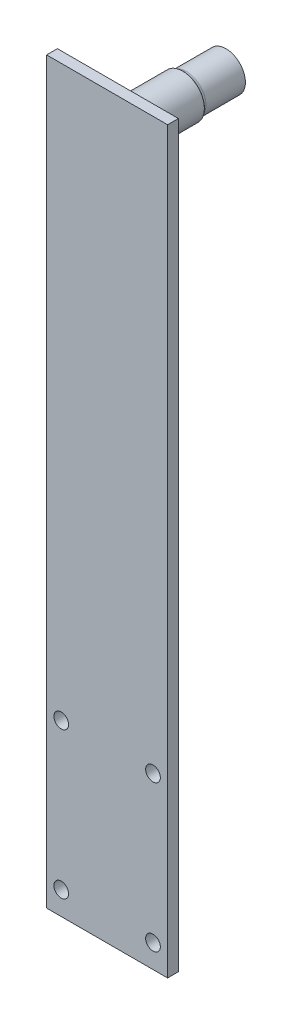
ISO-10303-21;
HEADER;
FILE_DESCRIPTION(('STEP AP214'),'2;1');
FILE_NAME('part.step','',(''),(''),'','','');
FILE_SCHEMA(('AUTOMOTIVE_DESIGN { 1 0 10303 214 1 1 1 1 }'));
ENDSEC;
DATA;
#1=APPLICATION_CONTEXT('core data for automotive mechanical design processes');
#2=APPLICATION_PROTOCOL_DEFINITION('international standard','automotive_design',2000,#1);
#3=PRODUCT_CONTEXT('',#1,'mechanical');
#4=PRODUCT('Part','Part','',(#3));
#5=PRODUCT_RELATED_PRODUCT_CATEGORY('part','',(#4));
#6=PRODUCT_DEFINITION_FORMATION('','',#4);
#7=PRODUCT_DEFINITION_CONTEXT('part definition',#1,'design');
#8=PRODUCT_DEFINITION('design','',#6,#7);
#9=PRODUCT_DEFINITION_SHAPE('','',#8);
#10=(LENGTH_UNIT() NAMED_UNIT(*) SI_UNIT(.MILLI.,.METRE.));
#11=(NAMED_UNIT(*) PLANE_ANGLE_UNIT() SI_UNIT($,.RADIAN.));
#12=(NAMED_UNIT(*) SI_UNIT($,.STERADIAN.) SOLID_ANGLE_UNIT());
#13=UNCERTAINTY_MEASURE_WITH_UNIT(LENGTH_MEASURE(1.E-05),#10,'distance_accuracy_value','');
#14=(GEOMETRIC_REPRESENTATION_CONTEXT(3) GLOBAL_UNCERTAINTY_ASSIGNED_CONTEXT((#13)) GLOBAL_UNIT_ASSIGNED_CONTEXT((#10,
#11,#12)) REPRESENTATION_CONTEXT('',''));
#15=CARTESIAN_POINT('',(0.,0.,0.));
#16=DIRECTION('',(0.,0.,1.));
#17=DIRECTION('',(1.,0.,0.));
#18=AXIS2_PLACEMENT_3D('',#15,#16,#17);
#19=CARTESIAN_POINT('',(28.,237.5709,-15.));
#20=DIRECTION('',(0.,-1.,0.));
#21=DIRECTION('',(0.,0.,-1.));
#22=AXIS2_PLACEMENT_3D('',#19,#20,#21);
#23=CYLINDRICAL_SURFACE('',#22,8.);
#24=CARTESIAN_POINT('',(28.,197.5709,-15.));
#25=DIRECTION('',(0.,-1.,0.));
#26=DIRECTION('',(0.,0.,-1.));
#27=AXIS2_PLACEMENT_3D('',#24,#25,#26);
#28=CIRCLE('',#27,8.);
#29=CARTESIAN_POINT('',(28.,197.5709,-23.));
#30=VERTEX_POINT('',#29);
#31=EDGE_CURVE('E126',#30,#30,#28,.T.);
#32=ORIENTED_EDGE('',*,*,#31,.T.);
#33=EDGE_LOOP('',(#32));
#34=FACE_BOUND('',#33,.T.);
#35=CARTESIAN_POINT('',(28.,232.5709,-15.));
#36=DIRECTION('',(0.,-0.707106781186547,0.707106781186547));
#37=DIRECTION('',(0.,-0.707106781186547,-0.707106781186547));
#38=AXIS2_PLACEMENT_3D('',#35,#36,#37);
#39=ELLIPSE('',#38,11.3137084989848,8.);
#40=CARTESIAN_POINT('',(36.,232.5709,-15.));
#41=VERTEX_POINT('',#40);
#42=CARTESIAN_POINT('',(20.,232.5709,-15.));
#43=VERTEX_POINT('',#42);
#44=EDGE_CURVE('E67',#41,#43,#39,.F.);
#45=ORIENTED_EDGE('',*,*,#44,.T.);
#46=CARTESIAN_POINT('',(28.,232.5709,-15.));
#47=DIRECTION('',(0.,-0.707106781186547,-0.707106781186547));
#48=DIRECTION('',(0.,-0.707106781186547,0.707106781186547));
#49=AXIS2_PLACEMENT_3D('',#46,#47,#48);
#50=ELLIPSE('',#49,11.3137084989848,8.);
#51=EDGE_CURVE('E272',#43,#41,#50,.F.);
#52=ORIENTED_EDGE('',*,*,#51,.T.);
#53=EDGE_LOOP('',(#45,#52));
#54=FACE_BOUND('',#53,.T.);
#55=ADVANCED_FACE('F45',(#34,#54),#23,.F.);
#56=CARTESIAN_POINT('',(0.,0.,5.));
#57=DIRECTION('',(1.,0.,0.));
#58=DIRECTION('',(0.,1.,0.));
#59=AXIS2_PLACEMENT_3D('',#56,#57,#58);
#60=PLANE('',#59);
#61=DIRECTION('',(0.,-1.,0.));
#62=VECTOR('',#61,1.);
#63=CARTESIAN_POINT('',(0.,0.,0.));
#64=LINE('',#63,#62);
#65=CARTESIAN_POINT('',(0.,252.5709,0.));
#66=VERTEX_POINT('',#65);
#67=CARTESIAN_POINT('',(0.,-89.4,0.));
#68=VERTEX_POINT('',#67);
#69=EDGE_CURVE('E176',#66,#68,#64,.T.);
#70=ORIENTED_EDGE('',*,*,#69,.T.);
#71=DIRECTION('',(0.,0.,-1.));
#72=VECTOR('',#71,1.);
#73=CARTESIAN_POINT('',(0.,-89.4,5.));
#74=LINE('',#73,#72);
#75=CARTESIAN_POINT('',(0.,-89.4,5.));
#76=VERTEX_POINT('',#75);
#77=EDGE_CURVE('E184',#76,#68,#74,.T.);
#78=ORIENTED_EDGE('',*,*,#77,.F.);
#79=DIRECTION('',(0.,-1.,0.));
#80=VECTOR('',#79,1.);
#81=CARTESIAN_POINT('',(0.,0.,5.));
#82=LINE('',#81,#80);
#83=CARTESIAN_POINT('',(0.,252.5709,5.));
#84=VERTEX_POINT('',#83);
#85=EDGE_CURVE('E167',#84,#76,#82,.T.);
#86=ORIENTED_EDGE('',*,*,#85,.F.);
#87=DIRECTION('',(0.,0.,1.));
#88=VECTOR('',#87,1.);
#89=CARTESIAN_POINT('',(0.,252.5709,0.));
#90=LINE('',#89,#88);
#91=EDGE_CURVE('E139',#66,#84,#90,.T.);
#92=ORIENTED_EDGE('',*,*,#91,.F.);
#93=EDGE_LOOP('',(#70,#78,#86,#92));
#94=FACE_BOUND('',#93,.T.);
#95=ADVANCED_FACE('F231',(#94),#60,.F.);
#96=CARTESIAN_POINT('',(0.,-89.4,5.));
#97=DIRECTION('',(0.,1.,0.));
#98=DIRECTION('',(0.,0.,1.));
#99=AXIS2_PLACEMENT_3D('',#96,#97,#98);
#100=PLANE('',#99);
#101=DIRECTION('',(1.,0.,0.));
#102=VECTOR('',#101,1.);
#103=CARTESIAN_POINT('',(0.,-89.4,0.));
#104=LINE('',#103,#102);
#105=CARTESIAN_POINT('',(56.,-89.4,0.));
#106=VERTEX_POINT('',#105);
#107=EDGE_CURVE('E179',#68,#106,#104,.T.);
#108=ORIENTED_EDGE('',*,*,#107,.T.);
#109=DIRECTION('',(0.,0.,-1.));
#110=VECTOR('',#109,1.);
#111=CARTESIAN_POINT('',(56.,-89.4,5.));
#112=LINE('',#111,#110);
#113=CARTESIAN_POINT('',(56.,-89.4,5.));
#114=VERTEX_POINT('',#113);
#115=EDGE_CURVE('E175',#114,#106,#112,.T.);
#116=ORIENTED_EDGE('',*,*,#115,.F.);
#117=DIRECTION('',(1.,0.,0.));
#118=VECTOR('',#117,1.);
#119=CARTESIAN_POINT('',(0.,-89.4,5.));
#120=LINE('',#119,#118);
#121=EDGE_CURVE('E170',#76,#114,#120,.T.);
#122=ORIENTED_EDGE('',*,*,#121,.F.);
#123=ORIENTED_EDGE('',*,*,#77,.T.);
#124=EDGE_LOOP('',(#108,#116,#122,#123));
#125=FACE_BOUND('',#124,.T.);
#126=ADVANCED_FACE('F237',(#125),#100,.F.);
#127=CARTESIAN_POINT('',(56.,0.,5.));
#128=DIRECTION('',(-1.,0.,0.));
#129=DIRECTION('',(0.,-1.,0.));
#130=AXIS2_PLACEMENT_3D('',#127,#128,#129);
#131=PLANE('',#130);
#132=DIRECTION('',(0.,1.,0.));
#133=VECTOR('',#132,1.);
#134=CARTESIAN_POINT('',(56.,0.,0.));
#135=LINE('',#134,#133);
#136=CARTESIAN_POINT('',(56.,252.5709,0.));
#137=VERTEX_POINT('',#136);
#138=EDGE_CURVE('E171',#106,#137,#135,.T.);
#139=ORIENTED_EDGE('',*,*,#138,.T.);
#140=DIRECTION('',(0.,0.,-1.));
#141=VECTOR('',#140,1.);
#142=CARTESIAN_POINT('',(56.,252.5709,0.));
#143=LINE('',#142,#141);
#144=CARTESIAN_POINT('',(56.,252.5709,5.));
#145=VERTEX_POINT('',#144);
#146=EDGE_CURVE('E145',#145,#137,#143,.T.);
#147=ORIENTED_EDGE('',*,*,#146,.F.);
#148=DIRECTION('',(0.,1.,0.));
#149=VECTOR('',#148,1.);
#150=CARTESIAN_POINT('',(56.,0.,5.));
#151=LINE('',#150,#149);
#152=EDGE_CURVE('E173',#114,#145,#151,.T.);
#153=ORIENTED_EDGE('',*,*,#152,.F.);
#154=ORIENTED_EDGE('',*,*,#115,.T.);
#155=EDGE_LOOP('',(#139,#147,#153,#154));
#156=FACE_BOUND('',#155,.T.);
#157=ADVANCED_FACE('F311',(#156),#131,.F.);
#158=CARTESIAN_POINT('',(0.,0.,5.));
#159=DIRECTION('',(0.,0.,1.));
#160=DIRECTION('',(1.,0.,0.));
#161=AXIS2_PLACEMENT_3D('',#158,#159,#160);
#162=PLANE('',#161);
#163=CARTESIAN_POINT('',(49.234030413572,-10.8013871611905,5.));
#164=DIRECTION('',(0.,0.,1.));
#165=DIRECTION('',(1.,0.,0.));
#166=AXIS2_PLACEMENT_3D('',#163,#164,#165);
#167=CIRCLE('',#166,3.39999999999999);
#168=CARTESIAN_POINT('',(52.6340304135719,-10.8013871611905,5.));
#169=VERTEX_POINT('',#168);
#170=EDGE_CURVE('E151',#169,#169,#167,.T.);
#171=ORIENTED_EDGE('',*,*,#170,.F.);
#172=EDGE_LOOP('',(#171));
#173=FACE_BOUND('',#172,.T.);
#174=CARTESIAN_POINT('',(6.76596958642805,-10.8013871611905,5.));
#175=DIRECTION('',(0.,0.,1.));
#176=DIRECTION('',(1.,0.,0.));
#177=AXIS2_PLACEMENT_3D('',#174,#175,#176);
#178=CIRCLE('',#177,3.39999999999999);
#179=CARTESIAN_POINT('',(10.165969586428,-10.8013871611905,5.));
#180=VERTEX_POINT('',#179);
#181=EDGE_CURVE('E155',#180,#180,#178,.T.);
#182=ORIENTED_EDGE('',*,*,#181,.F.);
#183=EDGE_LOOP('',(#182));
#184=FACE_BOUND('',#183,.T.);
#185=CARTESIAN_POINT('',(6.76596958642806,-78.5986128388095,5.));
#186=DIRECTION('',(0.,0.,1.));
#187=DIRECTION('',(1.,0.,0.));
#188=AXIS2_PLACEMENT_3D('',#185,#186,#187);
#189=CIRCLE('',#188,3.39999999999999);
#190=CARTESIAN_POINT('',(10.1659695864281,-78.5986128388095,5.));
#191=VERTEX_POINT('',#190);
#192=EDGE_CURVE('E159',#191,#191,#189,.T.);
#193=ORIENTED_EDGE('',*,*,#192,.F.);
#194=EDGE_LOOP('',(#193));
#195=FACE_BOUND('',#194,.T.);
#196=CARTESIAN_POINT('',(49.234030413572,-78.5986128388095,5.));
#197=DIRECTION('',(0.,0.,1.));
#198=DIRECTION('',(1.,0.,0.));
#199=AXIS2_PLACEMENT_3D('',#196,#197,#198);
#200=CIRCLE('',#199,3.39999999999999);
#201=CARTESIAN_POINT('',(52.6340304135719,-78.5986128388095,5.));
#202=VERTEX_POINT('',#201);
#203=EDGE_CURVE('E163',#202,#202,#200,.T.);
#204=ORIENTED_EDGE('',*,*,#203,.F.);
#205=EDGE_LOOP('',(#204));
#206=FACE_BOUND('',#205,.T.);
#207=ORIENTED_EDGE('',*,*,#85,.T.);
#208=ORIENTED_EDGE('',*,*,#121,.T.);
#209=ORIENTED_EDGE('',*,*,#152,.T.);
#210=DIRECTION('',(1.,0.,0.));
#211=VECTOR('',#210,1.);
#212=CARTESIAN_POINT('',(0.,252.5709,5.));
#213=LINE('',#212,#211);
#214=EDGE_CURVE('E142',#84,#145,#213,.T.);
#215=ORIENTED_EDGE('',*,*,#214,.F.);
#216=EDGE_LOOP('',(#207,#208,#209,#215));
#217=FACE_BOUND('',#216,.T.);
#218=ADVANCED_FACE('F291',(#173,#184,#195,#206,#217),#162,.T.);
#219=CARTESIAN_POINT('',(0.,0.,0.));
#220=DIRECTION('',(0.,0.,1.));
#221=DIRECTION('',(1.,0.,0.));
#222=AXIS2_PLACEMENT_3D('',#219,#220,#221);
#223=PLANE('',#222);
#224=CARTESIAN_POINT('',(28.,232.5709,0.));
#225=DIRECTION('',(0.,0.,1.));
#226=DIRECTION('',(1.,0.,0.));
#227=AXIS2_PLACEMENT_3D('',#224,#225,#226);
#228=CIRCLE('',#227,10.);
#229=CARTESIAN_POINT('',(38.,232.5709,0.));
#230=VERTEX_POINT('',#229);
#231=EDGE_CURVE('E187',#230,#230,#228,.F.);
#232=ORIENTED_EDGE('',*,*,#231,.F.);
#233=EDGE_LOOP('',(#232));
#234=FACE_BOUND('',#233,.T.);
#235=CARTESIAN_POINT('',(49.234030413572,-10.8013871611905,0.));
#236=DIRECTION('',(0.,0.,1.));
#237=DIRECTION('',(1.,0.,0.));
#238=AXIS2_PLACEMENT_3D('',#235,#236,#237);
#239=CIRCLE('',#238,3.39999999999999);
#240=CARTESIAN_POINT('',(52.6340304135719,-10.8013871611905,0.));
#241=VERTEX_POINT('',#240);
#242=EDGE_CURVE('E154',#241,#241,#239,.T.);
#243=ORIENTED_EDGE('',*,*,#242,.T.);
#244=EDGE_LOOP('',(#243));
#245=FACE_BOUND('',#244,.T.);
#246=CARTESIAN_POINT('',(6.76596958642805,-10.8013871611905,0.));
#247=DIRECTION('',(0.,0.,1.));
#248=DIRECTION('',(1.,0.,0.));
#249=AXIS2_PLACEMENT_3D('',#246,#247,#248);
#250=CIRCLE('',#249,3.39999999999999);
#251=CARTESIAN_POINT('',(10.165969586428,-10.8013871611905,0.));
#252=VERTEX_POINT('',#251);
#253=EDGE_CURVE('E158',#252,#252,#250,.T.);
#254=ORIENTED_EDGE('',*,*,#253,.T.);
#255=EDGE_LOOP('',(#254));
#256=FACE_BOUND('',#255,.T.);
#257=CARTESIAN_POINT('',(6.76596958642806,-78.5986128388095,0.));
#258=DIRECTION('',(0.,0.,1.));
#259=DIRECTION('',(1.,0.,0.));
#260=AXIS2_PLACEMENT_3D('',#257,#258,#259);
#261=CIRCLE('',#260,3.39999999999999);
#262=CARTESIAN_POINT('',(10.1659695864281,-78.5986128388095,0.));
#263=VERTEX_POINT('',#262);
#264=EDGE_CURVE('E162',#263,#263,#261,.T.);
#265=ORIENTED_EDGE('',*,*,#264,.T.);
#266=EDGE_LOOP('',(#265));
#267=FACE_BOUND('',#266,.T.);
#268=CARTESIAN_POINT('',(49.234030413572,-78.5986128388095,0.));
#269=DIRECTION('',(0.,0.,1.));
#270=DIRECTION('',(1.,0.,0.));
#271=AXIS2_PLACEMENT_3D('',#268,#269,#270);
#272=CIRCLE('',#271,3.39999999999999);
#273=CARTESIAN_POINT('',(52.6340304135719,-78.5986128388095,0.));
#274=VERTEX_POINT('',#273);
#275=EDGE_CURVE('E166',#274,#274,#272,.T.);
#276=ORIENTED_EDGE('',*,*,#275,.T.);
#277=EDGE_LOOP('',(#276));
#278=FACE_BOUND('',#277,.T.);
#279=ORIENTED_EDGE('',*,*,#69,.F.);
#280=DIRECTION('',(-1.,0.,0.));
#281=VECTOR('',#280,1.);
#282=CARTESIAN_POINT('',(0.,252.5709,0.));
#283=LINE('',#282,#281);
#284=EDGE_CURVE('E148',#137,#66,#283,.T.);
#285=ORIENTED_EDGE('',*,*,#284,.F.);
#286=ORIENTED_EDGE('',*,*,#138,.F.);
#287=ORIENTED_EDGE('',*,*,#107,.F.);
#288=EDGE_LOOP('',(#279,#285,#286,#287));
#289=FACE_BOUND('',#288,.T.);
#290=ADVANCED_FACE('F287',(#234,#245,#256,#267,#278,#289),#223,.F.);
#291=CARTESIAN_POINT('',(49.234030413572,-78.5986128388095,5.));
#292=DIRECTION('',(0.,0.,1.));
#293=DIRECTION('',(1.,0.,0.));
#294=AXIS2_PLACEMENT_3D('',#291,#292,#293);
#295=CYLINDRICAL_SURFACE('',#294,3.39999999999999);
#296=ORIENTED_EDGE('',*,*,#203,.T.);
#297=EDGE_LOOP('',(#296));
#298=FACE_BOUND('',#297,.T.);
#299=ORIENTED_EDGE('',*,*,#275,.F.);
#300=EDGE_LOOP('',(#299));
#301=FACE_BOUND('',#300,.T.);
#302=ADVANCED_FACE('F290',(#298,#301),#295,.F.);
#303=CARTESIAN_POINT('',(6.76596958642806,-78.5986128388095,5.));
#304=DIRECTION('',(0.,0.,1.));
#305=DIRECTION('',(1.,0.,0.));
#306=AXIS2_PLACEMENT_3D('',#303,#304,#305);
#307=CYLINDRICAL_SURFACE('',#306,3.39999999999999);
#308=ORIENTED_EDGE('',*,*,#192,.T.);
#309=EDGE_LOOP('',(#308));
#310=FACE_BOUND('',#309,.T.);
#311=ORIENTED_EDGE('',*,*,#264,.F.);
#312=EDGE_LOOP('',(#311));
#313=FACE_BOUND('',#312,.T.);
#314=ADVANCED_FACE('F326',(#310,#313),#307,.F.);
#315=CARTESIAN_POINT('',(6.76596958642805,-10.8013871611905,5.));
#316=DIRECTION('',(0.,0.,1.));
#317=DIRECTION('',(1.,0.,0.));
#318=AXIS2_PLACEMENT_3D('',#315,#316,#317);
#319=CYLINDRICAL_SURFACE('',#318,3.39999999999999);
#320=ORIENTED_EDGE('',*,*,#181,.T.);
#321=EDGE_LOOP('',(#320));
#322=FACE_BOUND('',#321,.T.);
#323=ORIENTED_EDGE('',*,*,#253,.F.);
#324=EDGE_LOOP('',(#323));
#325=FACE_BOUND('',#324,.T.);
#326=ADVANCED_FACE('F330',(#322,#325),#319,.F.);
#327=CARTESIAN_POINT('',(49.234030413572,-10.8013871611905,5.));
#328=DIRECTION('',(0.,0.,1.));
#329=DIRECTION('',(1.,0.,0.));
#330=AXIS2_PLACEMENT_3D('',#327,#328,#329);
#331=CYLINDRICAL_SURFACE('',#330,3.39999999999999);
#332=ORIENTED_EDGE('',*,*,#170,.T.);
#333=EDGE_LOOP('',(#332));
#334=FACE_BOUND('',#333,.T.);
#335=ORIENTED_EDGE('',*,*,#242,.F.);
#336=EDGE_LOOP('',(#335));
#337=FACE_BOUND('',#336,.T.);
#338=ADVANCED_FACE('F334',(#334,#337),#331,.F.);
#339=CARTESIAN_POINT('',(0.,252.5709,0.));
#340=DIRECTION('',(0.,1.,0.));
#341=DIRECTION('',(0.,0.,1.));
#342=AXIS2_PLACEMENT_3D('',#339,#340,#341);
#343=PLANE('',#342);
#344=ORIENTED_EDGE('',*,*,#91,.T.);
#345=ORIENTED_EDGE('',*,*,#214,.T.);
#346=ORIENTED_EDGE('',*,*,#146,.T.);
#347=ORIENTED_EDGE('',*,*,#284,.T.);
#348=EDGE_LOOP('',(#344,#345,#346,#347));
#349=FACE_BOUND('',#348,.T.);
#350=ADVANCED_FACE('F227',(#349),#343,.T.);
#351=CARTESIAN_POINT('',(28.,232.5709,-30.));
#352=DIRECTION('',(0.,0.,1.));
#353=DIRECTION('',(1.,0.,0.));
#354=AXIS2_PLACEMENT_3D('',#351,#352,#353);
#355=CYLINDRICAL_SURFACE('',#354,10.);
#356=CARTESIAN_POINT('',(28.,222.5709,-6.));
#357=CARTESIAN_POINT('',(28.2085913361397,222.570901779244,-6.00000180622063));
#358=CARTESIAN_POINT('',(28.4172126625181,222.577440869134,-6.00726591847946));
#359=CARTESIAN_POINT('',(28.8326612076838,222.603451954152,-6.03618053366535));
#360=CARTESIAN_POINT('',(29.0394880702716,222.622926460026,-6.05783382951101));
#361=CARTESIAN_POINT('',(29.4497828082892,222.674389910484,-6.115121252132));
#362=CARTESIAN_POINT('',(29.65324780366,222.706389058641,-6.15076677816125));
#363=CARTESIAN_POINT('',(30.0551155989831,222.782216776705,-6.23537388114841));
#364=CARTESIAN_POINT('',(30.253518523137,222.82604505607,-6.28433513105078));
#365=CARTESIAN_POINT('',(30.6426938154264,222.924336572428,-6.3943743139776));
#366=CARTESIAN_POINT('',(30.833508344562,222.978726717286,-6.45536901478479));
#367=CARTESIAN_POINT('',(31.2079890256735,223.097389200142,-6.58879689967516));
#368=CARTESIAN_POINT('',(31.3916525247795,223.161665162596,-6.66123427927368));
#369=CARTESIAN_POINT('',(31.7510200876309,223.299068808796,-6.81659189426605));
#370=CARTESIAN_POINT('',(31.9267248389148,223.372195725916,-6.89951122179269));
#371=CARTESIAN_POINT('',(32.2697213704164,223.526296746527,-7.07493825585736));
#372=CARTESIAN_POINT('',(32.4370112496394,223.607272611178,-7.16744811466192));
#373=CARTESIAN_POINT('',(32.8274790938943,223.80955906459,-7.39963690134386));
#374=CARTESIAN_POINT('',(33.0465116021778,223.934130398225,-7.54347295415123));
#375=CARTESIAN_POINT('',(33.4670749172249,224.194013366171,-7.84610273629846));
#376=CARTESIAN_POINT('',(33.6686045794494,224.329325701747,-8.00489744239517));
#377=CARTESIAN_POINT('',(34.0546103075005,224.608578687294,-8.33617752456395));
#378=CARTESIAN_POINT('',(34.2390463892942,224.752538330571,-8.50869332898665));
#379=CARTESIAN_POINT('',(34.5905025439924,225.046423790695,-8.86582948531501));
#380=CARTESIAN_POINT('',(34.7575248882405,225.196348825918,-9.05044825345329));
#381=CARTESIAN_POINT('',(35.0781455233206,225.503351265922,-9.43546219757944));
#382=CARTESIAN_POINT('',(35.2313403745246,225.660513927988,-9.63612473091824));
#383=CARTESIAN_POINT('',(35.5200926755409,225.975908514668,-10.0490692610473));
#384=CARTESIAN_POINT('',(35.6556453268349,226.134140717928,-10.2613543968676));
#385=CARTESIAN_POINT('',(35.9089318120991,226.448043892818,-10.6974101447493));
#386=CARTESIAN_POINT('',(36.0266974267846,226.603718978765,-10.9211592919081));
#387=CARTESIAN_POINT('',(36.2444160085851,226.908340368429,-11.3813821949684));
#388=CARTESIAN_POINT('',(36.3443803911403,227.057290938306,-11.6178476686292));
#389=CARTESIAN_POINT('',(36.5254781936128,227.341703468358,-12.1045833766424));
#390=CARTESIAN_POINT('',(36.6066770014447,227.477211297228,-12.354801796769));
#391=CARTESIAN_POINT('',(36.7488764460538,227.725536199049,-12.8718592670496));
#392=CARTESIAN_POINT('',(36.809896710755,227.838375279983,-13.1386818640688));
#393=CARTESIAN_POINT('',(36.9001839593344,228.010777706522,-13.6433352994184));
#394=CARTESIAN_POINT('',(36.9330773014659,228.076125733674,-13.8784292934967));
#395=CARTESIAN_POINT('',(36.9684471545365,228.147368420516,-14.2374727241863));
#396=CARTESIAN_POINT('',(36.9779068899324,228.16664834751,-14.3581288447596));
#397=CARTESIAN_POINT('',(36.9919650721053,228.195419213204,-14.6008612156947));
#398=CARTESIAN_POINT('',(36.9965657264706,228.204914597191,-14.7229367956562));
#399=CARTESIAN_POINT('',(37.0007848230825,228.213619202836,-14.9682368474728));
#400=CARTESIAN_POINT('',(37.0003748767102,228.212769814092,-15.0914639093434));
#401=CARTESIAN_POINT('',(36.9945182024308,228.20069568799,-15.3372820182562));
#402=CARTESIAN_POINT('',(36.9890713682094,228.189470731634,-15.459873051819));
#403=CARTESIAN_POINT('',(36.9732846397461,228.157230256571,-15.7036417550107));
#404=CARTESIAN_POINT('',(36.9629361750365,228.136197590154,-15.8248165666315));
#405=CARTESIAN_POINT('',(36.9376008919927,228.085357305212,-16.0648322690674));
#406=CARTESIAN_POINT('',(36.9226122567803,228.055546249695,-16.1836722262427));
#407=CARTESIAN_POINT('',(36.880948659007,227.973983221482,-16.4688357717717));
#408=CARTESIAN_POINT('',(36.852017780053,227.918301924532,-16.6337055047244));
#409=CARTESIAN_POINT('',(36.7861464093415,227.79507487607,-16.9572782148295));
#410=CARTESIAN_POINT('',(36.7492013821034,227.727522410383,-17.1159776397741));
#411=CARTESIAN_POINT('',(36.6678469379867,227.583386080974,-17.4278564348586));
#412=CARTESIAN_POINT('',(36.6234134780433,227.506773371758,-17.5810160306196));
#413=CARTESIAN_POINT('',(36.5276342946858,227.347093874776,-17.8817268974214));
#414=CARTESIAN_POINT('',(36.4762860015799,227.264024692529,-18.029276057245));
#415=CARTESIAN_POINT('',(36.3205044019129,227.020744094916,-18.4426116077224));
#416=CARTESIAN_POINT('',(36.2080787961444,226.855036986638,-18.7021759494695));
#417=CARTESIAN_POINT('',(35.9616458647517,226.516461205007,-19.2060478921735));
#418=CARTESIAN_POINT('',(35.8276221589941,226.343587170712,-19.4503437166754));
#419=CARTESIAN_POINT('',(35.5382026163241,225.996204042619,-19.9246991618829));
#420=CARTESIAN_POINT('',(35.3828069689313,225.821694963333,-20.1547589088033));
#421=CARTESIAN_POINT('',(35.0504983157023,225.475261283424,-20.6006908072791));
#422=CARTESIAN_POINT('',(34.8735944715964,225.303335617182,-20.8165689397595));
#423=CARTESIAN_POINT('',(34.5247581501197,224.989712013126,-21.2036543502054));
#424=CARTESIAN_POINT('',(34.3557363489217,224.847208910808,-21.3768335425801));
#425=CARTESIAN_POINT('',(34.0013481289936,224.56873775125,-21.7114231482439));
#426=CARTESIAN_POINT('',(33.8159807178401,224.432770091585,-21.87283284586));
#427=CARTESIAN_POINT('',(33.4291460534838,224.169769827139,-22.1823129764957));
#428=CARTESIAN_POINT('',(33.2277070317738,224.042722260675,-22.3304058689472));
#429=CARTESIAN_POINT('',(32.808617352121,223.799592403359,-22.6118895669229));
#430=CARTESIAN_POINT('',(32.5909725292392,223.68350619958,-22.7452856217026));
#431=CARTESIAN_POINT('',(32.1916709731594,223.489752862993,-22.9667689968427));
#432=CARTESIAN_POINT('',(32.0131949294924,223.409377397309,-23.0582344991303));
#433=CARTESIAN_POINT('',(31.6474418498809,223.257719786046,-23.2302474486268));
#434=CARTESIAN_POINT('',(31.4601699529768,223.186432418933,-23.3108011668405));
#435=CARTESIAN_POINT('',(31.0774502611466,223.054057522129,-23.4599925516259));
#436=CARTESIAN_POINT('',(30.8820032845477,222.992968974575,-23.5286314073522));
#437=CARTESIAN_POINT('',(30.4838871930948,222.882092344946,-23.6529639604204));
#438=CARTESIAN_POINT('',(30.2812179802827,222.832304416214,-23.7086574821021));
#439=CARTESIAN_POINT('',(29.8683877693337,222.744711544211,-23.8065009399278));
#440=CARTESIAN_POINT('',(29.6581817072951,222.707000064565,-23.8485452733247));
#441=CARTESIAN_POINT('',(29.2333650445442,222.644929865573,-23.9176855419605));
#442=CARTESIAN_POINT('',(29.0187544330658,222.620571178869,-23.9447814406561));
#443=CARTESIAN_POINT('',(28.587115538672,222.585803526044,-23.9834416079966));
#444=CARTESIAN_POINT('',(28.3700884820616,222.57538778279,-23.9950134223132));
#445=CARTESIAN_POINT('',(27.9355606462413,222.56874788827,-24.0023913520665));
#446=CARTESIAN_POINT('',(27.7180599171174,222.572522303042,-23.9981990605174));
#447=CARTESIAN_POINT('',(27.3102279917264,222.592881022462,-23.9755714121752));
#448=CARTESIAN_POINT('',(27.1197177497011,222.607902068152,-23.958874151062));
#449=CARTESIAN_POINT('',(26.7412082044018,222.648617892908,-23.9135728617917));
#450=CARTESIAN_POINT('',(26.5532097537311,222.674316205801,-23.8849648915726));
#451=CARTESIAN_POINT('',(26.1810862489142,222.735905615826,-23.8163112603645));
#452=CARTESIAN_POINT('',(25.9969600003422,222.771793518819,-23.7762691836116));
#453=CARTESIAN_POINT('',(25.6335143046835,222.853161315724,-23.6853242491777));
#454=CARTESIAN_POINT('',(25.4541967180539,222.898644863494,-23.6344172542343));
#455=CARTESIAN_POINT('',(25.0970485934564,222.999686335665,-23.521080171789));
#456=CARTESIAN_POINT('',(24.9193582390544,223.055460787869,-23.4584017694316));
#457=CARTESIAN_POINT('',(24.5707026433321,223.17547744642,-23.3231563440933));
#458=CARTESIAN_POINT('',(24.3997400184977,223.239722905786,-23.2505855218799));
#459=CARTESIAN_POINT('',(23.897820306647,223.44388606374,-23.0192078430351));
#460=CARTESIAN_POINT('',(23.5776637453548,223.595279198598,-22.8466815113024));
#461=CARTESIAN_POINT('',(23.0455051266881,223.88066786748,-22.5183083026827));
#462=CARTESIAN_POINT('',(22.8264863824879,224.009537095803,-22.3690907316302));
#463=CARTESIAN_POINT('',(22.4063741454901,224.27792495995,-22.0554961792651));
#464=CARTESIAN_POINT('',(22.2052883766053,224.417448136969,-21.8911127272793));
#465=CARTESIAN_POINT('',(21.8206831221644,224.704906117644,-21.548479606848));
#466=CARTESIAN_POINT('',(21.6372106534257,224.852861842216,-21.3701950078597));
#467=CARTESIAN_POINT('',(21.2882028675691,225.154368840684,-21.0013525269213));
#468=CARTESIAN_POINT('',(21.1226646817035,225.307919214398,-20.8107966156746));
#469=CARTESIAN_POINT('',(20.805610654151,225.6216821486,-20.4135786092288));
#470=CARTESIAN_POINT('',(20.6545044518155,225.781966719408,-20.2066470267015));
#471=CARTESIAN_POINT('',(20.3704526038051,226.102831779222,-19.78074947262));
#472=CARTESIAN_POINT('',(20.237513265823,226.263412351488,-19.5617793580015));
#473=CARTESIAN_POINT('',(19.990101730647,226.580750816954,-19.1118514564308));
#474=CARTESIAN_POINT('',(19.8755892234955,226.737516399543,-18.8809213381463));
#475=CARTESIAN_POINT('',(19.6651221096018,227.042425622215,-18.4054918099199));
#476=CARTESIAN_POINT('',(19.5691523345766,227.190576239541,-18.1610037031854));
#477=CARTESIAN_POINT('',(19.4015998955852,227.462906077539,-17.67037218093));
#478=CARTESIAN_POINT('',(19.3289500017041,227.587964452315,-17.4250935429641));
#479=CARTESIAN_POINT('',(19.203062363877,227.813742729309,-16.9187996729557));
#480=CARTESIAN_POINT('',(19.1497965276606,227.914497780993,-16.6578078581129));
#481=CARTESIAN_POINT('',(19.0726146734763,228.064470747098,-16.1634301460142));
#482=CARTESIAN_POINT('',(19.0453475190922,228.119384668858,-15.9323951717101));
#483=CARTESIAN_POINT('',(19.017990558377,228.175005071986,-15.5808376987626));
#484=CARTESIAN_POINT('',(19.0111289298876,228.189086352151,-15.4628896803701));
#485=CARTESIAN_POINT('',(19.0020600818379,228.207736204008,-15.2260446232584));
#486=CARTESIAN_POINT('',(18.9998526316817,228.212305246994,-15.10714763185));
#487=CARTESIAN_POINT('',(19.0001630253505,228.211664538471,-14.8691094398613));
#488=CARTESIAN_POINT('',(19.0026918410545,228.206432081121,-14.7499683124927));
#489=CARTESIAN_POINT('',(19.0124177040826,228.18644139253,-14.5126611210543));
#490=CARTESIAN_POINT('',(19.0196167707775,228.17167904067,-14.3944955011781));
#491=CARTESIAN_POINT('',(19.0479976418049,228.11404581472,-14.0423978656974));
#492=CARTESIAN_POINT('',(19.0759622601491,228.057831652852,-13.8111059525906));
#493=CARTESIAN_POINT('',(19.1395710132859,227.934481575362,-13.4112465798393));
#494=CARTESIAN_POINT('',(19.1720232485522,227.87273525958,-13.2403748313293));
#495=CARTESIAN_POINT('',(19.2454872583504,227.737220047026,-12.9052687795976));
#496=CARTESIAN_POINT('',(19.2865047195313,227.663443170057,-12.7410389730202));
#497=CARTESIAN_POINT('',(19.3765317931998,227.506912748086,-12.4185377446044));
#498=CARTESIAN_POINT('',(19.4255678520498,227.42412981306,-12.2602882481096));
#499=CARTESIAN_POINT('',(19.5310681267716,227.252311000965,-11.9497425951741));
#500=CARTESIAN_POINT('',(19.5875350634096,227.16327283918,-11.7974486459397));
#501=CARTESIAN_POINT('',(19.7563712894072,226.906838953906,-11.3767309777983));
#502=CARTESIAN_POINT('',(19.8768770626667,226.734570085531,-11.1145159101296));
#503=CARTESIAN_POINT('',(20.1404667473417,226.384139572448,-10.6057074601173));
#504=CARTESIAN_POINT('',(20.2835669148598,226.205973758546,-10.3591255058204));
#505=CARTESIAN_POINT('',(20.5921899570078,225.849296151417,-9.88089140785304));
#506=CARTESIAN_POINT('',(20.7577024514213,225.670784555843,-9.64923242551091));
#507=CARTESIAN_POINT('',(21.1114289780502,225.317621736703,-9.20094454960925));
#508=CARTESIAN_POINT('',(21.2996325594041,225.142968779484,-8.98430880864812));
#509=CARTESIAN_POINT('',(21.6614830119723,224.833411934753,-8.60640139565765));
#510=CARTESIAN_POINT('',(21.8311800735496,224.697224147069,-8.4423941637244));
#511=CARTESIAN_POINT('',(22.1860098798685,224.43169780469,-8.12584260924155));
#512=CARTESIAN_POINT('',(22.3711430985513,224.302359460494,-7.97329863892567));
#513=CARTESIAN_POINT('',(22.7565856016635,224.05272802984,-7.68118927827036));
#514=CARTESIAN_POINT('',(22.9568721183908,223.932421893915,-7.54160509216291));
#515=CARTESIAN_POINT('',(23.3726335635874,223.702763937031,-7.2767764280579));
#516=CARTESIAN_POINT('',(23.5881043792582,223.593409169081,-7.1515280910079));
#517=CARTESIAN_POINT('',(23.9856462061494,223.410003240012,-6.9424587634964));
#518=CARTESIAN_POINT('',(24.164917958767,223.33342070625,-6.85552471885519));
#519=CARTESIAN_POINT('',(24.531924634017,223.189467083462,-6.69260937195569));
#520=CARTESIAN_POINT('',(24.7196577065877,223.122093993665,-6.61662569051293));
#521=CARTESIAN_POINT('',(25.1026423812541,222.997718101737,-6.47668853595409));
#522=CARTESIAN_POINT('',(25.297885348771,222.940703797288,-6.41272171668868));
#523=CARTESIAN_POINT('',(25.6950411488145,222.838007219968,-6.29770874115147));
#524=CARTESIAN_POINT('',(25.8969525781158,222.792322580029,-6.24665988592802));
#525=CARTESIAN_POINT('',(26.2555476708779,222.722980490987,-6.16927327885519));
#526=CARTESIAN_POINT('',(26.411083000713,222.69666951165,-6.13994633505408));
#527=CARTESIAN_POINT('',(26.7245103316701,222.651313917385,-6.0894269330371));
#528=CARTESIAN_POINT('',(26.8824020470149,222.632268428638,-6.06823349660407));
#529=CARTESIAN_POINT('',(27.1998494766877,222.601687871395,-6.03421804606566));
#530=CARTESIAN_POINT('',(27.3594055833785,222.590154616431,-6.02139805339444));
#531=CARTESIAN_POINT('',(27.6793020023174,222.574760819361,-6.00428925065085));
#532=CARTESIAN_POINT('',(27.839642139033,222.570898632178,-5.99999861143956));
#533=CARTESIAN_POINT('',(28.,222.5709,-6.));
#534=B_SPLINE_CURVE_WITH_KNOTS('',3,(#356,#357,#358,#359,#360,#361,#362,#363,#364,#365,#366,
#367,#368,#369,#370,#371,#372,#373,#374,#375,#376,#377,#378,#379,#380,#381,#382,#383,#384,#385,
#386,#387,#388,#389,#390,#391,#392,#393,#394,#395,#396,#397,#398,#399,#400,#401,#402,#403,#404,
#405,#406,#407,#408,#409,#410,#411,#412,#413,#414,#415,#416,#417,#418,#419,#420,#421,#422,#423,
#424,#425,#426,#427,#428,#429,#430,#431,#432,#433,#434,#435,#436,#437,#438,#439,#440,#441,#442,
#443,#444,#445,#446,#447,#448,#449,#450,#451,#452,#453,#454,#455,#456,#457,#458,#459,#460,#461,
#462,#463,#464,#465,#466,#467,#468,#469,#470,#471,#472,#473,#474,#475,#476,#477,#478,#479,#480,
#481,#482,#483,#484,#485,#486,#487,#488,#489,#490,#491,#492,#493,#494,#495,#496,#497,#498,#499,
#500,#501,#502,#503,#504,#505,#506,#507,#508,#509,#510,#511,#512,#513,#514,#515,#516,#517,#518,
#519,#520,#521,#522,#523,#524,#525,#526,#527,#528,#529,#530,#531,#532,#533),.UNSPECIFIED.,.T.,
.F.,(4,2,2,2,2,2,2,2,2,2,2,2,2,2,2,2,2,2,2,2,2,2,2,2,2,2,2,2,2,2,2,2,2,2,2,2,2,2,2,2,2,2,2,2,2,
2,2,2,2,2,2,2,2,2,2,2,2,2,2,2,2,2,2,2,2,2,2,2,2,2,2,2,2,2,2,2,2,2,2,2,2,2,2,2,2,2,2,2,4),(0.,
0.625599569992078,1.25132060338868,1.87755246357627,2.50376894389349,3.1257970022424,
3.74805366193297,4.37025646332821,4.99259920035767,5.86174188069048,6.73094135292046,
7.60212522117004,8.47319531488765,9.3645607019732,10.2561680279423,11.1461629472878,
12.0355850658416,12.9218596596806,13.8072696096435,14.5428179193646,14.9100463190637,
15.2771078068983,15.6462499187349,16.0153998222739,16.385197578114,16.7551403133437,
17.2834681121513,17.8120956934475,18.3424540504672,18.8730100460837,19.8550160222377,
20.8377702934605,21.8205158504915,22.8028442497725,23.6446119799876,24.4864308533495,
25.3268022321223,26.1668724764833,26.8144552368054,27.4616642377519,28.1088086072679,
28.7559617576222,29.4080087423387,30.0600573210596,30.7117888485995,31.3634545183138,
31.9382646879031,32.5132652526179,33.0880857700774,33.6631255657611,34.252034956617,
34.8411711616209,36.0189002515613,36.9019217884768,37.7853218331211,38.6710180126057,
39.5565723072899,40.4624761651917,41.3686937659057,42.2729011814504,43.1763657783953,
44.0290696770353,44.8805328295965,45.5944542774487,45.9509891435096,46.3075063442749,
46.6648504628519,47.0223491966041,47.7380595231407,48.2910346616418,48.8443781069182,
49.3995847880302,49.9549953229288,50.9617880460392,51.9693084601141,52.9763638293941,
53.9829571371706,54.7996924766855,55.6164529019226,56.4320096328727,57.2473463060455,
57.8871096525014,58.5267337873885,59.1656432889699,59.8044191926998,60.2854036536038,
60.7663302483514,61.2473729007821,61.7283123814065),.UNSPECIFIED.);
#535=CARTESIAN_POINT('',(28.,222.5709,-6.));
#536=VERTEX_POINT('',#535);
#537=EDGE_CURVE('E123',#536,#536,#534,.T.);
#538=ORIENTED_EDGE('',*,*,#537,.T.);
#539=EDGE_LOOP('',(#538));
#540=FACE_BOUND('',#539,.T.);
#541=CARTESIAN_POINT('',(28.,232.5709,-30.));
#542=DIRECTION('',(0.,0.,-1.));
#543=DIRECTION('',(-1.,0.,0.));
#544=AXIS2_PLACEMENT_3D('',#541,#542,#543);
#545=CIRCLE('',#544,10.);
#546=CARTESIAN_POINT('',(18.,232.5709,-30.));
#547=VERTEX_POINT('',#546);
#548=EDGE_CURVE('E136',#547,#547,#545,.T.);
#549=ORIENTED_EDGE('',*,*,#548,.F.);
#550=EDGE_LOOP('',(#549));
#551=FACE_BOUND('',#550,.T.);
#552=ORIENTED_EDGE('',*,*,#231,.T.);
#553=EDGE_LOOP('',(#552));
#554=FACE_BOUND('',#553,.T.);
#555=ADVANCED_FACE('F206',(#540,#551,#554),#355,.T.);
#556=CARTESIAN_POINT('',(28.,232.5709,-50.));
#557=DIRECTION('',(0.,0.,1.));
#558=DIRECTION('',(1.,0.,0.));
#559=AXIS2_PLACEMENT_3D('',#556,#557,#558);
#560=CYLINDRICAL_SURFACE('',#559,9.00000000000001);
#561=CARTESIAN_POINT('',(28.,232.5709,-31.7320508075689));
#562=DIRECTION('',(0.,0.,1.));
#563=DIRECTION('',(1.,0.,0.));
#564=AXIS2_PLACEMENT_3D('',#561,#562,#563);
#565=CIRCLE('',#564,9.00000000000001);
#566=CARTESIAN_POINT('',(37.,232.5709,-31.7320508075689));
#567=VERTEX_POINT('',#566);
#568=EDGE_CURVE('E111',#567,#567,#565,.F.);
#569=ORIENTED_EDGE('',*,*,#568,.T.);
#570=EDGE_LOOP('',(#569));
#571=FACE_BOUND('',#570,.T.);
#572=CARTESIAN_POINT('',(28.,232.5709,-50.));
#573=DIRECTION('',(0.,0.,-1.));
#574=DIRECTION('',(-1.,0.,0.));
#575=AXIS2_PLACEMENT_3D('',#572,#573,#574);
#576=CIRCLE('',#575,9.00000000000001);
#577=CARTESIAN_POINT('',(19.,232.5709,-50.));
#578=VERTEX_POINT('',#577);
#579=EDGE_CURVE('E133',#578,#578,#576,.T.);
#580=ORIENTED_EDGE('',*,*,#579,.F.);
#581=EDGE_LOOP('',(#580));
#582=FACE_BOUND('',#581,.T.);
#583=ADVANCED_FACE('F220',(#571,#582),#560,.T.);
#584=CARTESIAN_POINT('',(28.,232.5709,-50.));
#585=DIRECTION('',(0.,0.,-1.));
#586=DIRECTION('',(-1.,0.,0.));
#587=AXIS2_PLACEMENT_3D('',#584,#585,#586);
#588=PLANE('',#587);
#589=CARTESIAN_POINT('',(28.,232.5709,-50.));
#590=DIRECTION('',(0.,0.,-1.));
#591=DIRECTION('',(-1.,0.,0.));
#592=AXIS2_PLACEMENT_3D('',#589,#590,#591);
#593=CIRCLE('',#592,8.);
#594=CARTESIAN_POINT('',(20.,232.5709,-50.));
#595=VERTEX_POINT('',#594);
#596=EDGE_CURVE('E268',#595,#595,#593,.T.);
#597=ORIENTED_EDGE('',*,*,#596,.F.);
#598=EDGE_LOOP('',(#597));
#599=FACE_BOUND('',#598,.T.);
#600=ORIENTED_EDGE('',*,*,#579,.T.);
#601=EDGE_LOOP('',(#600));
#602=FACE_BOUND('',#601,.T.);
#603=ADVANCED_FACE('F218',(#599,#602),#588,.T.);
#604=CARTESIAN_POINT('',(28.,232.5709,-31.7320508075689));
#605=DIRECTION('',(0.,0.,1.));
#606=DIRECTION('',(1.,0.,0.));
#607=AXIS2_PLACEMENT_3D('',#604,#605,#606);
#608=TOROIDAL_SURFACE('',#607,11.,2.);
#609=ORIENTED_EDGE('',*,*,#548,.T.);
#610=EDGE_LOOP('',(#609));
#611=FACE_BOUND('',#610,.T.);
#612=ORIENTED_EDGE('',*,*,#568,.F.);
#613=EDGE_LOOP('',(#612));
#614=FACE_BOUND('',#613,.T.);
#615=ADVANCED_FACE('F47',(#611,#614),#608,.F.);
#616=CARTESIAN_POINT('',(28.,197.5709,-15.));
#617=DIRECTION('',(0.,1.,0.));
#618=DIRECTION('',(0.,0.,1.));
#619=AXIS2_PLACEMENT_3D('',#616,#617,#618);
#620=CYLINDRICAL_SURFACE('',#619,9.);
#621=CARTESIAN_POINT('',(28.,197.5709,-15.));
#622=DIRECTION('',(0.,1.,0.));
#623=DIRECTION('',(0.,0.,1.));
#624=AXIS2_PLACEMENT_3D('',#621,#622,#623);
#625=CIRCLE('',#624,9.);
#626=CARTESIAN_POINT('',(28.,197.5709,-6.));
#627=VERTEX_POINT('',#626);
#628=EDGE_CURVE('E119',#627,#627,#625,.T.);
#629=ORIENTED_EDGE('',*,*,#628,.T.);
#630=EDGE_LOOP('',(#629));
#631=FACE_BOUND('',#630,.T.);
#632=ORIENTED_EDGE('',*,*,#537,.F.);
#633=EDGE_LOOP('',(#632));
#634=FACE_BOUND('',#633,.T.);
#635=ADVANCED_FACE('F210',(#631,#634),#620,.T.);
#636=CARTESIAN_POINT('',(28.,197.5709,-15.));
#637=DIRECTION('',(0.,1.,0.));
#638=DIRECTION('',(0.,0.,1.));
#639=AXIS2_PLACEMENT_3D('',#636,#637,#638);
#640=PLANE('',#639);
#641=ORIENTED_EDGE('',*,*,#31,.F.);
#642=EDGE_LOOP('',(#641));
#643=FACE_BOUND('',#642,.T.);
#644=ORIENTED_EDGE('',*,*,#628,.F.);
#645=EDGE_LOOP('',(#644));
#646=FACE_BOUND('',#645,.T.);
#647=ADVANCED_FACE('F215',(#643,#646),#640,.F.);
#648=CARTESIAN_POINT('',(28.,232.5709,-4.99999999999999));
#649=DIRECTION('',(0.,0.,-1.));
#650=DIRECTION('',(-1.,0.,0.));
#651=AXIS2_PLACEMENT_3D('',#648,#649,#650);
#652=CYLINDRICAL_SURFACE('',#651,8.);
#653=CARTESIAN_POINT('',(28.,232.5709,-4.99999999999999));
#654=DIRECTION('',(0.,0.,-1.));
#655=DIRECTION('',(-1.,0.,0.));
#656=AXIS2_PLACEMENT_3D('',#653,#654,#655);
#657=CIRCLE('',#656,8.);
#658=CARTESIAN_POINT('',(20.,232.5709,-4.99999999999999));
#659=VERTEX_POINT('',#658);
#660=EDGE_CURVE('E116',#659,#659,#657,.T.);
#661=ORIENTED_EDGE('',*,*,#660,.F.);
#662=EDGE_LOOP('',(#661));
#663=FACE_BOUND('',#662,.T.);
#664=ORIENTED_EDGE('',*,*,#596,.T.);
#665=EDGE_LOOP('',(#664));
#666=FACE_BOUND('',#665,.T.);
#667=ORIENTED_EDGE('',*,*,#44,.F.);
#668=CARTESIAN_POINT('',(28.,232.5709,-15.));
#669=DIRECTION('',(0.,-0.707106781186547,-0.707106781186547));
#670=DIRECTION('',(0.,-0.707106781186547,0.707106781186547));
#671=AXIS2_PLACEMENT_3D('',#668,#669,#670);
#672=ELLIPSE('',#671,11.3137084989848,8.);
#673=CARTESIAN_POINT('',(34.2449979983984,237.5709,-20.));
#674=VERTEX_POINT('',#673);
#675=EDGE_CURVE('E107',#674,#41,#672,.T.);
#676=ORIENTED_EDGE('',*,*,#675,.F.);
#677=DIRECTION('',(0.,0.,-1.));
#678=VECTOR('',#677,1.);
#679=CARTESIAN_POINT('',(34.2449979983984,237.5709,-4.99999999999999));
#680=LINE('',#679,#678);
#681=CARTESIAN_POINT('',(34.2449979983984,237.5709,-9.99999999999999));
#682=VERTEX_POINT('',#681);
#683=EDGE_CURVE('E53',#674,#682,#680,.F.);
#684=ORIENTED_EDGE('',*,*,#683,.T.);
#685=CARTESIAN_POINT('',(28.,232.5709,-15.));
#686=DIRECTION('',(0.,-0.707106781186547,0.707106781186547));
#687=DIRECTION('',(0.,-0.707106781186547,-0.707106781186547));
#688=AXIS2_PLACEMENT_3D('',#685,#686,#687);
#689=ELLIPSE('',#688,11.3137084989848,8.);
#690=EDGE_CURVE('E105',#41,#682,#689,.T.);
#691=ORIENTED_EDGE('',*,*,#690,.F.);
#692=ORIENTED_EDGE('',*,*,#51,.F.);
#693=CARTESIAN_POINT('',(21.7550020016016,237.5709,-10.));
#694=VERTEX_POINT('',#693);
#695=EDGE_CURVE('E60',#694,#43,#689,.T.);
#696=ORIENTED_EDGE('',*,*,#695,.F.);
#697=DIRECTION('',(0.,0.,-1.));
#698=VECTOR('',#697,1.);
#699=CARTESIAN_POINT('',(21.7550020016016,237.5709,-4.99999999999999));
#700=LINE('',#699,#698);
#701=CARTESIAN_POINT('',(21.7550020016016,237.5709,-20.));
#702=VERTEX_POINT('',#701);
#703=EDGE_CURVE('E11',#694,#702,#700,.T.);
#704=ORIENTED_EDGE('',*,*,#703,.T.);
#705=EDGE_CURVE('E131',#43,#702,#672,.T.);
#706=ORIENTED_EDGE('',*,*,#705,.F.);
#707=EDGE_LOOP('',(#667,#676,#684,#691,#692,#696,#704,#706));
#708=FACE_BOUND('',#707,.T.);
#709=ADVANCED_FACE('F103',(#663,#666,#708),#652,.F.);
#710=CARTESIAN_POINT('',(28.,232.5709,-4.99999999999999));
#711=DIRECTION('',(0.,0.,-1.));
#712=DIRECTION('',(-1.,0.,0.));
#713=AXIS2_PLACEMENT_3D('',#710,#711,#712);
#714=PLANE('',#713);
#715=ORIENTED_EDGE('',*,*,#660,.T.);
#716=EDGE_LOOP('',(#715));
#717=FACE_BOUND('',#716,.T.);
#718=ADVANCED_FACE('F248',(#717),#714,.T.);
#719=CARTESIAN_POINT('',(28.,237.5709,-15.));
#720=DIRECTION('',(0.,-1.,0.));
#721=DIRECTION('',(0.,0.,-1.));
#722=AXIS2_PLACEMENT_3D('',#719,#720,#721);
#723=PLANE('',#722);
#724=ORIENTED_EDGE('',*,*,#703,.F.);
#725=CARTESIAN_POINT('',(28.,237.5709,-15.));
#726=DIRECTION('',(0.,-1.,0.));
#727=DIRECTION('',(0.,0.,-1.));
#728=AXIS2_PLACEMENT_3D('',#725,#726,#727);
#729=CIRCLE('',#728,8.);
#730=EDGE_CURVE('E120',#694,#702,#729,.T.);
#731=ORIENTED_EDGE('',*,*,#730,.T.);
#732=EDGE_LOOP('',(#724,#731));
#733=FACE_BOUND('',#732,.T.);
#734=ADVANCED_FACE('F243',(#733),#723,.T.);
#735=ORIENTED_EDGE('',*,*,#695,.T.);
#736=ORIENTED_EDGE('',*,*,#705,.T.);
#737=ORIENTED_EDGE('',*,*,#730,.F.);
#738=EDGE_LOOP('',(#735,#736,#737));
#739=FACE_BOUND('',#738,.T.);
#740=ADVANCED_FACE('F233',(#739),#23,.F.);
#741=ORIENTED_EDGE('',*,*,#683,.F.);
#742=EDGE_CURVE('E114',#674,#682,#729,.T.);
#743=ORIENTED_EDGE('',*,*,#742,.T.);
#744=EDGE_LOOP('',(#741,#743));
#745=FACE_BOUND('',#744,.T.);
#746=ADVANCED_FACE('F118',(#745),#723,.T.);
#747=ORIENTED_EDGE('',*,*,#742,.F.);
#748=ORIENTED_EDGE('',*,*,#675,.T.);
#749=ORIENTED_EDGE('',*,*,#690,.T.);
#750=EDGE_LOOP('',(#747,#748,#749));
#751=FACE_BOUND('',#750,.T.);
#752=ADVANCED_FACE('F113',(#751),#23,.F.);
#753=CLOSED_SHELL('',(#55,#95,#126,#157,#218,#290,#302,#314,#326,#338,#350,#555,#583,#603,#615,
#635,#647,#709,#718,#734,#740,#746,#752));
#754=MANIFOLD_SOLID_BREP('B2',#753);
#755=ADVANCED_BREP_SHAPE_REPRESENTATION('',(#18,#754),#14);
#756=SHAPE_DEFINITION_REPRESENTATION(#9,#755);
ENDSEC;
END-ISO-10303-21;
